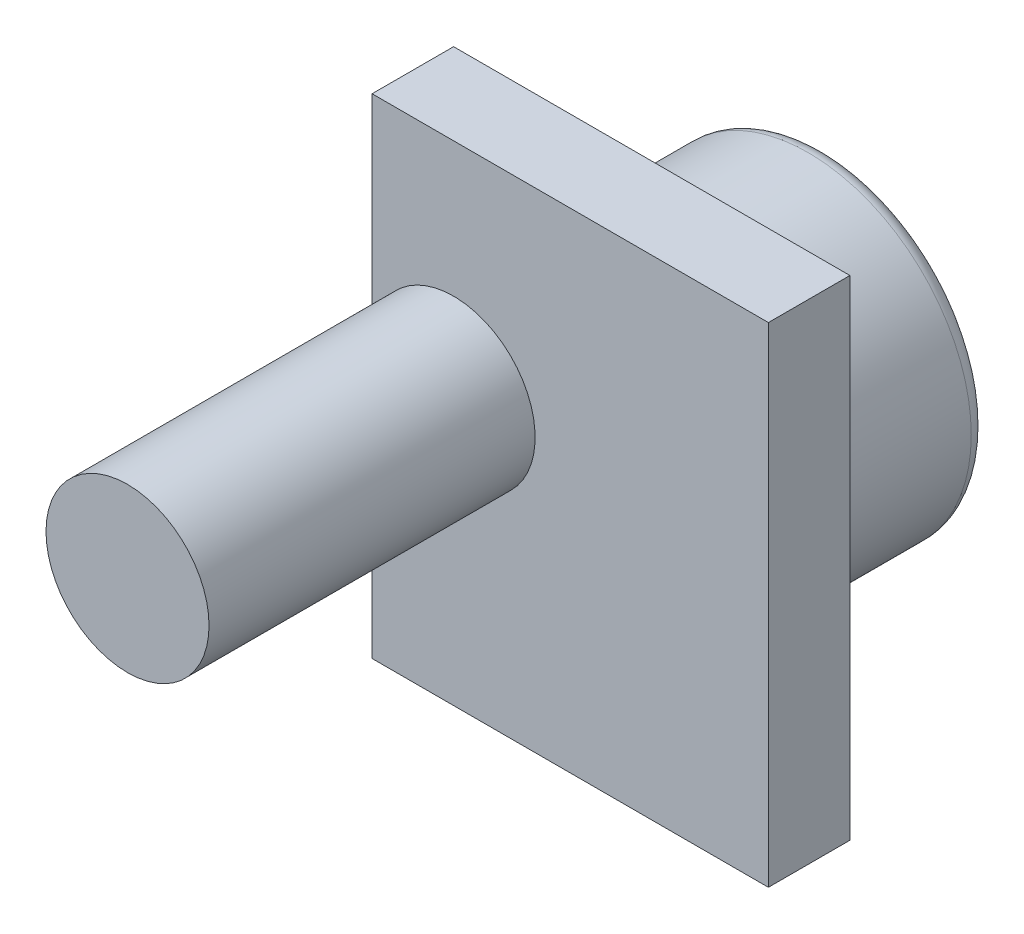
ISO-10303-21;
HEADER;
FILE_DESCRIPTION(('STEP AP214'),'2;1');
FILE_NAME('part.step','',(''),(''),'','','');
FILE_SCHEMA(('AUTOMOTIVE_DESIGN { 1 0 10303 214 1 1 1 1 }'));
ENDSEC;
DATA;
#1=APPLICATION_CONTEXT('core data for automotive mechanical design processes');
#2=APPLICATION_PROTOCOL_DEFINITION('international standard','automotive_design',2000,#1);
#3=PRODUCT_CONTEXT('',#1,'mechanical');
#4=PRODUCT('Part','Part','',(#3));
#5=PRODUCT_RELATED_PRODUCT_CATEGORY('part','',(#4));
#6=PRODUCT_DEFINITION_FORMATION('','',#4);
#7=PRODUCT_DEFINITION_CONTEXT('part definition',#1,'design');
#8=PRODUCT_DEFINITION('design','',#6,#7);
#9=PRODUCT_DEFINITION_SHAPE('','',#8);
#10=(LENGTH_UNIT() NAMED_UNIT(*) SI_UNIT(.MILLI.,.METRE.));
#11=(NAMED_UNIT(*) PLANE_ANGLE_UNIT() SI_UNIT($,.RADIAN.));
#12=(NAMED_UNIT(*) SI_UNIT($,.STERADIAN.) SOLID_ANGLE_UNIT());
#13=UNCERTAINTY_MEASURE_WITH_UNIT(LENGTH_MEASURE(1.E-05),#10,'distance_accuracy_value','');
#14=(GEOMETRIC_REPRESENTATION_CONTEXT(3) GLOBAL_UNCERTAINTY_ASSIGNED_CONTEXT((#13)) GLOBAL_UNIT_ASSIGNED_CONTEXT((#10,
#11,#12)) REPRESENTATION_CONTEXT('',''));
#15=CARTESIAN_POINT('',(0.,0.,0.));
#16=DIRECTION('',(0.,0.,1.));
#17=DIRECTION('',(1.,0.,0.));
#18=AXIS2_PLACEMENT_3D('',#15,#16,#17);
#19=CARTESIAN_POINT('',(-80.8676769495731,-8.43948731295555,-3.6));
#20=DIRECTION('',(0.,0.,-1.));
#21=DIRECTION('',(-1.,0.,0.));
#22=AXIS2_PLACEMENT_3D('',#19,#20,#21);
#23=CYLINDRICAL_SURFACE('',#22,2.5);
#24=CARTESIAN_POINT('',(-80.8676769495731,-8.43948731295555,-3.6));
#25=DIRECTION('',(0.,0.,-1.));
#26=DIRECTION('',(-1.,0.,0.));
#27=AXIS2_PLACEMENT_3D('',#24,#25,#26);
#28=CIRCLE('',#27,2.5);
#29=CARTESIAN_POINT('',(-83.3676769495731,-8.43948731295555,-3.6));
#30=VERTEX_POINT('',#29);
#31=EDGE_CURVE('E11',#30,#30,#28,.T.);
#32=ORIENTED_EDGE('',*,*,#31,.T.);
#33=EDGE_LOOP('',(#32));
#34=FACE_BOUND('',#33,.T.);
#35=CARTESIAN_POINT('',(-80.8676769495731,-8.43948731295555,-4.));
#36=DIRECTION('',(0.,0.,-1.));
#37=DIRECTION('',(-1.,0.,0.));
#38=AXIS2_PLACEMENT_3D('',#35,#36,#37);
#39=CIRCLE('',#38,2.5);
#40=CARTESIAN_POINT('',(-83.3676769495731,-8.43948731295555,-4.));
#41=VERTEX_POINT('',#40);
#42=EDGE_CURVE('E56',#41,#41,#39,.T.);
#43=ORIENTED_EDGE('',*,*,#42,.F.);
#44=EDGE_LOOP('',(#43));
#45=FACE_BOUND('',#44,.T.);
#46=ADVANCED_FACE('F53',(#34,#45),#23,.T.);
#47=CARTESIAN_POINT('',(-80.8676769495731,-8.43948731295555,-3.6));
#48=DIRECTION('',(0.,0.,-1.));
#49=DIRECTION('',(-1.,0.,0.));
#50=AXIS2_PLACEMENT_3D('',#47,#48,#49);
#51=PLANE('',#50);
#52=ORIENTED_EDGE('',*,*,#31,.F.);
#53=EDGE_LOOP('',(#52));
#54=FACE_BOUND('',#53,.T.);
#55=ADVANCED_FACE('F68',(#54),#51,.F.);
#56=CARTESIAN_POINT('',(-80.8676769495731,-8.43948731295555,-4.));
#57=DIRECTION('',(0.,0.,-1.));
#58=DIRECTION('',(-1.,0.,0.));
#59=AXIS2_PLACEMENT_3D('',#56,#57,#58);
#60=PLANE('',#59);
#61=ORIENTED_EDGE('',*,*,#42,.T.);
#62=EDGE_LOOP('',(#61));
#63=FACE_BOUND('',#62,.T.);
#64=ADVANCED_FACE('F65',(#63),#60,.T.);
#65=CLOSED_SHELL('',(#46,#55,#64));
#66=MANIFOLD_SOLID_BREP('B2',#65);
#67=CARTESIAN_POINT('',(-80.8676769495731,-8.43948731295555,-4.));
#68=DIRECTION('',(0.,0.,1.));
#69=DIRECTION('',(1.,0.,0.));
#70=AXIS2_PLACEMENT_3D('',#67,#68,#69);
#71=CYLINDRICAL_SURFACE('',#70,4.00000000000001);
#72=CARTESIAN_POINT('',(-80.8676769495731,-8.43948731295555,-3.6));
#73=DIRECTION('',(0.,0.,1.));
#74=DIRECTION('',(1.,0.,0.));
#75=AXIS2_PLACEMENT_3D('',#72,#73,#74);
#76=CIRCLE('',#75,4.00000000000001);
#77=CARTESIAN_POINT('',(-76.8676769495731,-8.43948731295555,-3.6));
#78=VERTEX_POINT('',#77);
#79=EDGE_CURVE('E110',#78,#78,#76,.T.);
#80=ORIENTED_EDGE('',*,*,#79,.T.);
#81=EDGE_LOOP('',(#80));
#82=FACE_BOUND('',#81,.T.);
#83=CARTESIAN_POINT('',(-80.8676769495731,-8.43948731295555,0.));
#84=DIRECTION('',(0.,0.,1.));
#85=DIRECTION('',(1.,0.,0.));
#86=AXIS2_PLACEMENT_3D('',#83,#84,#85);
#87=CIRCLE('',#86,4.00000000000001);
#88=CARTESIAN_POINT('',(-76.8676769495731,-8.43948731295555,0.));
#89=VERTEX_POINT('',#88);
#90=EDGE_CURVE('E199',#89,#89,#87,.T.);
#91=ORIENTED_EDGE('',*,*,#90,.F.);
#92=EDGE_LOOP('',(#91));
#93=FACE_BOUND('',#92,.T.);
#94=ADVANCED_FACE('F100',(#82,#93),#71,.T.);
#95=CARTESIAN_POINT('',(-80.8676769495731,-8.43948731295555,-4.));
#96=DIRECTION('',(0.,0.,1.));
#97=DIRECTION('',(1.,0.,0.));
#98=AXIS2_PLACEMENT_3D('',#95,#96,#97);
#99=PLANE('',#98);
#100=CARTESIAN_POINT('',(-80.8676769495731,-8.43948731295555,-4.));
#101=DIRECTION('',(0.,0.,-1.));
#102=DIRECTION('',(-1.,0.,0.));
#103=AXIS2_PLACEMENT_3D('',#100,#101,#102);
#104=CIRCLE('',#103,2.5);
#105=CARTESIAN_POINT('',(-83.3676769495731,-8.43948731295555,-4.));
#106=VERTEX_POINT('',#105);
#107=EDGE_CURVE('E260',#106,#106,#104,.T.);
#108=ORIENTED_EDGE('',*,*,#107,.F.);
#109=EDGE_LOOP('',(#108));
#110=FACE_BOUND('',#109,.T.);
#111=CARTESIAN_POINT('',(-80.8676769495731,-8.43948731295555,-4.));
#112=DIRECTION('',(0.,0.,1.));
#113=DIRECTION('',(1.,0.,0.));
#114=AXIS2_PLACEMENT_3D('',#111,#112,#113);
#115=CIRCLE('',#114,3.60000000000001);
#116=CARTESIAN_POINT('',(-77.2676769495731,-8.43948731295555,-4.));
#117=VERTEX_POINT('',#116);
#118=EDGE_CURVE('E51',#117,#117,#115,.F.);
#119=ORIENTED_EDGE('',*,*,#118,.T.);
#120=EDGE_LOOP('',(#119));
#121=FACE_BOUND('',#120,.T.);
#122=ADVANCED_FACE('F223',(#110,#121),#99,.F.);
#123=CARTESIAN_POINT('',(-85.9676769495731,-2.93948731295555,2.));
#124=DIRECTION('',(1.,0.,0.));
#125=DIRECTION('',(0.,0.,-1.));
#126=AXIS2_PLACEMENT_3D('',#123,#124,#125);
#127=PLANE('',#126);
#128=DIRECTION('',(0.,-1.,0.));
#129=VECTOR('',#128,1.);
#130=CARTESIAN_POINT('',(-85.9676769495731,-2.93948731295555,0.));
#131=LINE('',#130,#129);
#132=CARTESIAN_POINT('',(-85.9676769495731,-2.93948731295555,0.));
#133=VERTEX_POINT('',#132);
#134=CARTESIAN_POINT('',(-85.9676769495731,-14.9394873129555,0.));
#135=VERTEX_POINT('',#134);
#136=EDGE_CURVE('E180',#133,#135,#131,.T.);
#137=ORIENTED_EDGE('',*,*,#136,.T.);
#138=DIRECTION('',(0.,0.,-1.));
#139=VECTOR('',#138,1.);
#140=CARTESIAN_POINT('',(-85.9676769495731,-14.9394873129555,2.));
#141=LINE('',#140,#139);
#142=CARTESIAN_POINT('',(-85.9676769495731,-14.9394873129555,2.));
#143=VERTEX_POINT('',#142);
#144=EDGE_CURVE('E165',#143,#135,#141,.T.);
#145=ORIENTED_EDGE('',*,*,#144,.F.);
#146=DIRECTION('',(0.,-1.,0.));
#147=VECTOR('',#146,1.);
#148=CARTESIAN_POINT('',(-85.9676769495731,-2.93948731295555,2.));
#149=LINE('',#148,#147);
#150=CARTESIAN_POINT('',(-85.9676769495731,-8.23948731295554,2.));
#151=VERTEX_POINT('',#150);
#152=EDGE_CURVE('E149',#151,#143,#149,.T.);
#153=ORIENTED_EDGE('',*,*,#152,.F.);
#154=CARTESIAN_POINT('',(-85.9676769495731,-2.93948731295555,2.));
#155=VERTEX_POINT('',#154);
#156=EDGE_CURVE('E153',#155,#151,#149,.T.);
#157=ORIENTED_EDGE('',*,*,#156,.F.);
#158=DIRECTION('',(0.,0.,-1.));
#159=VECTOR('',#158,1.);
#160=CARTESIAN_POINT('',(-85.9676769495731,-2.93948731295555,2.));
#161=LINE('',#160,#159);
#162=EDGE_CURVE('E179',#155,#133,#161,.T.);
#163=ORIENTED_EDGE('',*,*,#162,.T.);
#164=EDGE_LOOP('',(#137,#145,#153,#157,#163));
#165=FACE_BOUND('',#164,.T.);
#166=ADVANCED_FACE('F163',(#165),#127,.F.);
#167=CARTESIAN_POINT('',(-85.9676769495731,-14.9394873129555,2.));
#168=DIRECTION('',(0.,1.,0.));
#169=DIRECTION('',(0.,0.,1.));
#170=AXIS2_PLACEMENT_3D('',#167,#168,#169);
#171=PLANE('',#170);
#172=DIRECTION('',(1.,0.,0.));
#173=VECTOR('',#172,1.);
#174=CARTESIAN_POINT('',(-85.9676769495731,-14.9394873129555,0.));
#175=LINE('',#174,#173);
#176=CARTESIAN_POINT('',(-76.2445096963185,-14.9394873129555,0.));
#177=VERTEX_POINT('',#176);
#178=EDGE_CURVE('E183',#135,#177,#175,.T.);
#179=ORIENTED_EDGE('',*,*,#178,.T.);
#180=DIRECTION('',(0.,0.,-1.));
#181=VECTOR('',#180,1.);
#182=CARTESIAN_POINT('',(-76.2445096963185,-14.9394873129555,2.));
#183=LINE('',#182,#181);
#184=CARTESIAN_POINT('',(-76.2445096963185,-14.9394873129555,2.));
#185=VERTEX_POINT('',#184);
#186=EDGE_CURVE('E194',#185,#177,#183,.T.);
#187=ORIENTED_EDGE('',*,*,#186,.F.);
#188=DIRECTION('',(1.,0.,0.));
#189=VECTOR('',#188,1.);
#190=CARTESIAN_POINT('',(-85.9676769495731,-14.9394873129555,2.));
#191=LINE('',#190,#189);
#192=EDGE_CURVE('E159',#143,#185,#191,.T.);
#193=ORIENTED_EDGE('',*,*,#192,.F.);
#194=ORIENTED_EDGE('',*,*,#144,.T.);
#195=EDGE_LOOP('',(#179,#187,#193,#194));
#196=FACE_BOUND('',#195,.T.);
#197=ADVANCED_FACE('F232',(#196),#171,.F.);
#198=CARTESIAN_POINT('',(-76.2445096963185,-2.93948731295555,2.));
#199=DIRECTION('',(-1.,0.,0.));
#200=DIRECTION('',(0.,0.,1.));
#201=AXIS2_PLACEMENT_3D('',#198,#199,#200);
#202=PLANE('',#201);
#203=DIRECTION('',(0.,1.,0.));
#204=VECTOR('',#203,1.);
#205=CARTESIAN_POINT('',(-76.2445096963185,-2.93948731295555,0.));
#206=LINE('',#205,#204);
#207=CARTESIAN_POINT('',(-76.2445096963185,-2.93948731295555,0.));
#208=VERTEX_POINT('',#207);
#209=EDGE_CURVE('E136',#177,#208,#206,.T.);
#210=ORIENTED_EDGE('',*,*,#209,.T.);
#211=DIRECTION('',(0.,0.,-1.));
#212=VECTOR('',#211,1.);
#213=CARTESIAN_POINT('',(-76.2445096963185,-2.93948731295555,2.));
#214=LINE('',#213,#212);
#215=CARTESIAN_POINT('',(-76.2445096963185,-2.93948731295555,2.));
#216=VERTEX_POINT('',#215);
#217=EDGE_CURVE('E191',#216,#208,#214,.T.);
#218=ORIENTED_EDGE('',*,*,#217,.F.);
#219=DIRECTION('',(0.,1.,0.));
#220=VECTOR('',#219,1.);
#221=CARTESIAN_POINT('',(-76.2445096963185,-2.93948731295555,2.));
#222=LINE('',#221,#220);
#223=EDGE_CURVE('E174',#185,#216,#222,.T.);
#224=ORIENTED_EDGE('',*,*,#223,.F.);
#225=ORIENTED_EDGE('',*,*,#186,.T.);
#226=EDGE_LOOP('',(#210,#218,#224,#225));
#227=FACE_BOUND('',#226,.T.);
#228=ADVANCED_FACE('F235',(#227),#202,.F.);
#229=CARTESIAN_POINT('',(-85.9676769495731,-2.93948731295555,2.));
#230=DIRECTION('',(0.,-1.,0.));
#231=DIRECTION('',(0.,0.,-1.));
#232=AXIS2_PLACEMENT_3D('',#229,#230,#231);
#233=PLANE('',#232);
#234=DIRECTION('',(-1.,0.,0.));
#235=VECTOR('',#234,1.);
#236=CARTESIAN_POINT('',(-85.9676769495731,-2.93948731295555,0.));
#237=LINE('',#236,#235);
#238=EDGE_CURVE('E142',#208,#133,#237,.T.);
#239=ORIENTED_EDGE('',*,*,#238,.T.);
#240=ORIENTED_EDGE('',*,*,#162,.F.);
#241=DIRECTION('',(-1.,0.,0.));
#242=VECTOR('',#241,1.);
#243=CARTESIAN_POINT('',(-85.9676769495731,-2.93948731295555,2.));
#244=LINE('',#243,#242);
#245=EDGE_CURVE('E118',#216,#155,#244,.T.);
#246=ORIENTED_EDGE('',*,*,#245,.F.);
#247=ORIENTED_EDGE('',*,*,#217,.T.);
#248=EDGE_LOOP('',(#239,#240,#246,#247));
#249=FACE_BOUND('',#248,.T.);
#250=ADVANCED_FACE('F239',(#249),#233,.F.);
#251=CARTESIAN_POINT('',(0.,0.,2.));
#252=DIRECTION('',(0.,0.,1.));
#253=DIRECTION('',(1.,0.,0.));
#254=AXIS2_PLACEMENT_3D('',#251,#252,#253);
#255=PLANE('',#254);
#256=ORIENTED_EDGE('',*,*,#156,.T.);
#257=CARTESIAN_POINT('',(-83.9676769495731,-8.23948731295554,2.));
#258=DIRECTION('',(0.,0.,1.));
#259=DIRECTION('',(1.,0.,0.));
#260=AXIS2_PLACEMENT_3D('',#257,#258,#259);
#261=CIRCLE('',#260,2.);
#262=EDGE_CURVE('E156',#151,#151,#261,.T.);
#263=ORIENTED_EDGE('',*,*,#262,.F.);
#264=ORIENTED_EDGE('',*,*,#152,.T.);
#265=ORIENTED_EDGE('',*,*,#192,.T.);
#266=ORIENTED_EDGE('',*,*,#223,.T.);
#267=ORIENTED_EDGE('',*,*,#245,.T.);
#268=EDGE_LOOP('',(#256,#263,#264,#265,#266,#267));
#269=FACE_BOUND('',#268,.T.);
#270=ADVANCED_FACE('F154',(#269),#255,.T.);
#271=CARTESIAN_POINT('',(0.,0.,0.));
#272=DIRECTION('',(0.,0.,1.));
#273=DIRECTION('',(1.,0.,0.));
#274=AXIS2_PLACEMENT_3D('',#271,#272,#273);
#275=PLANE('',#274);
#276=ORIENTED_EDGE('',*,*,#90,.T.);
#277=EDGE_LOOP('',(#276));
#278=FACE_BOUND('',#277,.T.);
#279=ORIENTED_EDGE('',*,*,#136,.F.);
#280=ORIENTED_EDGE('',*,*,#238,.F.);
#281=ORIENTED_EDGE('',*,*,#209,.F.);
#282=ORIENTED_EDGE('',*,*,#178,.F.);
#283=EDGE_LOOP('',(#279,#280,#281,#282));
#284=FACE_BOUND('',#283,.T.);
#285=ADVANCED_FACE('F210',(#278,#284),#275,.F.);
#286=CARTESIAN_POINT('',(-80.8676769495731,-8.43948731295555,-3.6));
#287=DIRECTION('',(0.,0.,1.));
#288=DIRECTION('',(1.,0.,0.));
#289=AXIS2_PLACEMENT_3D('',#286,#287,#288);
#290=TOROIDAL_SURFACE('',#289,3.60000000000001,0.4);
#291=ORIENTED_EDGE('',*,*,#118,.F.);
#292=EDGE_LOOP('',(#291));
#293=FACE_BOUND('',#292,.T.);
#294=ORIENTED_EDGE('',*,*,#79,.F.);
#295=EDGE_LOOP('',(#294));
#296=FACE_BOUND('',#295,.T.);
#297=ADVANCED_FACE('F102',(#293,#296),#290,.T.);
#298=CARTESIAN_POINT('',(-83.9676769495731,-8.23948731295554,10.));
#299=DIRECTION('',(0.,0.,-1.));
#300=DIRECTION('',(-1.,0.,0.));
#301=AXIS2_PLACEMENT_3D('',#298,#299,#300);
#302=CYLINDRICAL_SURFACE('',#301,2.);
#303=CARTESIAN_POINT('',(-83.9676769495731,-8.23948731295554,10.));
#304=DIRECTION('',(0.,0.,1.));
#305=DIRECTION('',(1.,0.,0.));
#306=AXIS2_PLACEMENT_3D('',#303,#304,#305);
#307=CIRCLE('',#306,2.);
#308=CARTESIAN_POINT('',(-81.9676769495731,-8.23948731295554,10.));
#309=VERTEX_POINT('',#308);
#310=EDGE_CURVE('E184',#309,#309,#307,.T.);
#311=ORIENTED_EDGE('',*,*,#310,.F.);
#312=EDGE_LOOP('',(#311));
#313=FACE_BOUND('',#312,.T.);
#314=ORIENTED_EDGE('',*,*,#262,.T.);
#315=EDGE_LOOP('',(#314));
#316=FACE_BOUND('',#315,.T.);
#317=ADVANCED_FACE('F209',(#313,#316),#302,.T.);
#318=CARTESIAN_POINT('',(-83.9676769495731,-8.23948731295554,10.));
#319=DIRECTION('',(0.,0.,1.));
#320=DIRECTION('',(1.,0.,0.));
#321=AXIS2_PLACEMENT_3D('',#318,#319,#320);
#322=PLANE('',#321);
#323=ORIENTED_EDGE('',*,*,#310,.T.);
#324=EDGE_LOOP('',(#323));
#325=FACE_BOUND('',#324,.T.);
#326=ADVANCED_FACE('F216',(#325),#322,.T.);
#327=CARTESIAN_POINT('',(-80.8676769495731,-8.43948731295555,-3.6));
#328=DIRECTION('',(0.,0.,-1.));
#329=DIRECTION('',(-1.,0.,0.));
#330=AXIS2_PLACEMENT_3D('',#327,#328,#329);
#331=CYLINDRICAL_SURFACE('',#330,2.5);
#332=CARTESIAN_POINT('',(-80.8676769495731,-8.43948731295555,-3.6));
#333=DIRECTION('',(0.,0.,-1.));
#334=DIRECTION('',(-1.,0.,0.));
#335=AXIS2_PLACEMENT_3D('',#332,#333,#334);
#336=CIRCLE('',#335,2.5);
#337=CARTESIAN_POINT('',(-83.3676769495731,-8.43948731295555,-3.6));
#338=VERTEX_POINT('',#337);
#339=EDGE_CURVE('E258',#338,#338,#336,.T.);
#340=ORIENTED_EDGE('',*,*,#339,.F.);
#341=EDGE_LOOP('',(#340));
#342=FACE_BOUND('',#341,.T.);
#343=ORIENTED_EDGE('',*,*,#107,.T.);
#344=EDGE_LOOP('',(#343));
#345=FACE_BOUND('',#344,.T.);
#346=ADVANCED_FACE('F246',(#342,#345),#331,.F.);
#347=CARTESIAN_POINT('',(-80.8676769495731,-8.43948731295555,-3.6));
#348=DIRECTION('',(0.,0.,-1.));
#349=DIRECTION('',(-1.,0.,0.));
#350=AXIS2_PLACEMENT_3D('',#347,#348,#349);
#351=PLANE('',#350);
#352=ORIENTED_EDGE('',*,*,#339,.T.);
#353=EDGE_LOOP('',(#352));
#354=FACE_BOUND('',#353,.T.);
#355=ADVANCED_FACE('F250',(#354),#351,.T.);
#356=CLOSED_SHELL('',(#94,#122,#166,#197,#228,#250,#270,#285,#297,#317,#326,#346,#355));
#357=MANIFOLD_SOLID_BREP('B6',#356);
#358=ADVANCED_BREP_SHAPE_REPRESENTATION('',(#18,#66,#357),#14);
#359=SHAPE_DEFINITION_REPRESENTATION(#9,#358);
ENDSEC;
END-ISO-10303-21;
